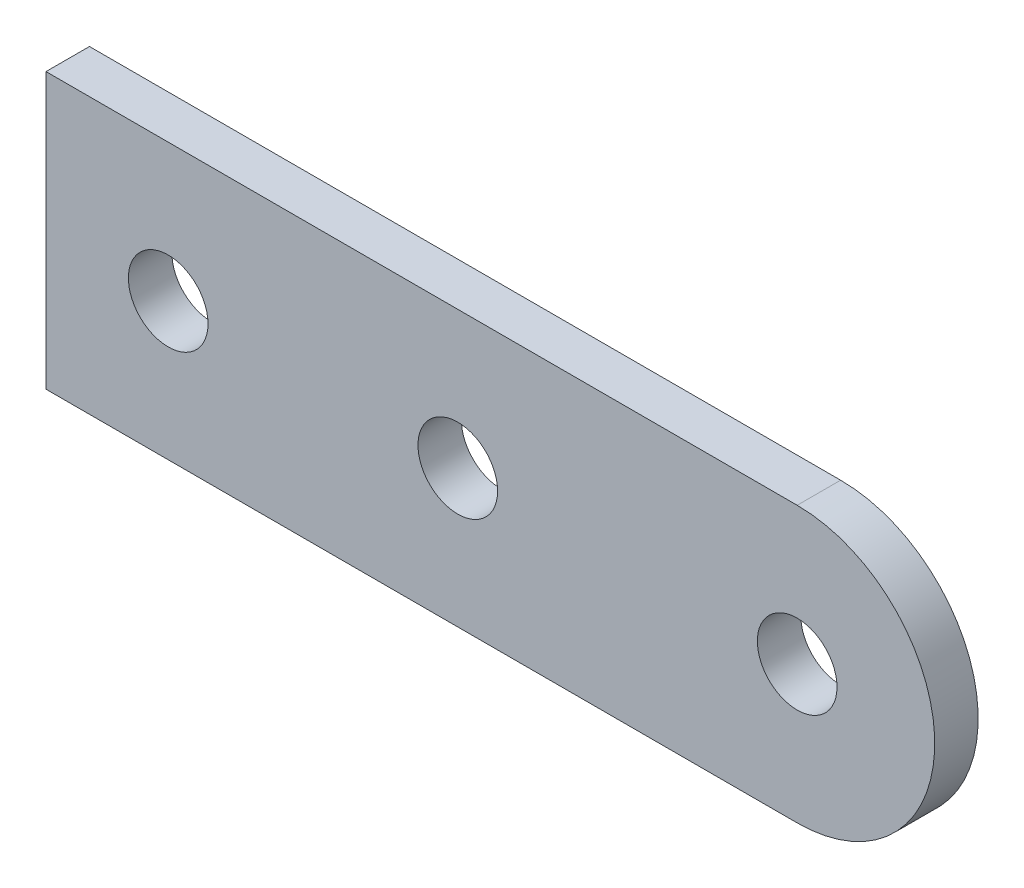
ISO-10303-21;
HEADER;
FILE_DESCRIPTION(('STEP AP214'),'2;1');
FILE_NAME('part.step','',(''),(''),'','','');
FILE_SCHEMA(('AUTOMOTIVE_DESIGN { 1 0 10303 214 1 1 1 1 }'));
ENDSEC;
DATA;
#1=APPLICATION_CONTEXT('core data for automotive mechanical design processes');
#2=APPLICATION_PROTOCOL_DEFINITION('international standard','automotive_design',2000,#1);
#3=PRODUCT_CONTEXT('',#1,'mechanical');
#4=PRODUCT('Part','Part','',(#3));
#5=PRODUCT_RELATED_PRODUCT_CATEGORY('part','',(#4));
#6=PRODUCT_DEFINITION_FORMATION('','',#4);
#7=PRODUCT_DEFINITION_CONTEXT('part definition',#1,'design');
#8=PRODUCT_DEFINITION('design','',#6,#7);
#9=PRODUCT_DEFINITION_SHAPE('','',#8);
#10=(LENGTH_UNIT() NAMED_UNIT(*) SI_UNIT(.MILLI.,.METRE.));
#11=(NAMED_UNIT(*) PLANE_ANGLE_UNIT() SI_UNIT($,.RADIAN.));
#12=(NAMED_UNIT(*) SI_UNIT($,.STERADIAN.) SOLID_ANGLE_UNIT());
#13=UNCERTAINTY_MEASURE_WITH_UNIT(LENGTH_MEASURE(1.E-05),#10,'distance_accuracy_value','');
#14=(GEOMETRIC_REPRESENTATION_CONTEXT(3) GLOBAL_UNCERTAINTY_ASSIGNED_CONTEXT((#13)) GLOBAL_UNIT_ASSIGNED_CONTEXT((#10,
#11,#12)) REPRESENTATION_CONTEXT('',''));
#15=CARTESIAN_POINT('',(0.,0.,0.));
#16=DIRECTION('',(0.,0.,1.));
#17=DIRECTION('',(1.,0.,0.));
#18=AXIS2_PLACEMENT_3D('',#15,#16,#17);
#19=CARTESIAN_POINT('',(-51.8799999999999,9.49999999999999,3.));
#20=DIRECTION('',(1.,0.,0.));
#21=DIRECTION('',(0.,0.,-1.));
#22=AXIS2_PLACEMENT_3D('',#19,#20,#21);
#23=PLANE('',#22);
#24=DIRECTION('',(0.,-1.,0.));
#25=VECTOR('',#24,1.);
#26=CARTESIAN_POINT('',(-51.8799999999999,9.49999999999999,0.));
#27=LINE('',#26,#25);
#28=CARTESIAN_POINT('',(-51.8799999999999,9.49999999999999,0.));
#29=VERTEX_POINT('',#28);
#30=CARTESIAN_POINT('',(-51.8799999999999,-9.49999999999999,0.));
#31=VERTEX_POINT('',#30);
#32=EDGE_CURVE('E96',#29,#31,#27,.T.);
#33=ORIENTED_EDGE('',*,*,#32,.T.);
#34=DIRECTION('',(0.,0.,-1.));
#35=VECTOR('',#34,1.);
#36=CARTESIAN_POINT('',(-51.8799999999999,-9.49999999999999,3.));
#37=LINE('',#36,#35);
#38=CARTESIAN_POINT('',(-51.8799999999999,-9.49999999999999,3.));
#39=VERTEX_POINT('',#38);
#40=EDGE_CURVE('E11',#39,#31,#37,.T.);
#41=ORIENTED_EDGE('',*,*,#40,.F.);
#42=DIRECTION('',(0.,-1.,0.));
#43=VECTOR('',#42,1.);
#44=CARTESIAN_POINT('',(-51.8799999999999,9.49999999999999,3.));
#45=LINE('',#44,#43);
#46=CARTESIAN_POINT('',(-51.8799999999999,9.49999999999999,3.));
#47=VERTEX_POINT('',#46);
#48=EDGE_CURVE('E84',#47,#39,#45,.T.);
#49=ORIENTED_EDGE('',*,*,#48,.F.);
#50=DIRECTION('',(0.,0.,-1.));
#51=VECTOR('',#50,1.);
#52=CARTESIAN_POINT('',(-51.8799999999999,9.49999999999999,3.));
#53=LINE('',#52,#51);
#54=EDGE_CURVE('E92',#47,#29,#53,.T.);
#55=ORIENTED_EDGE('',*,*,#54,.T.);
#56=EDGE_LOOP('',(#33,#41,#49,#55));
#57=FACE_BOUND('',#56,.T.);
#58=ADVANCED_FACE('F33',(#57),#23,.F.);
#59=CARTESIAN_POINT('',(-51.8799999999999,-9.49999999999999,3.));
#60=DIRECTION('',(0.,1.,0.));
#61=DIRECTION('',(0.,0.,1.));
#62=AXIS2_PLACEMENT_3D('',#59,#60,#61);
#63=PLANE('',#62);
#64=DIRECTION('',(1.,0.,0.));
#65=VECTOR('',#64,1.);
#66=CARTESIAN_POINT('',(-51.8799999999999,-9.49999999999999,0.));
#67=LINE('',#66,#65);
#68=CARTESIAN_POINT('',(0.,-9.49999999999999,0.));
#69=VERTEX_POINT('',#68);
#70=EDGE_CURVE('E88',#31,#69,#67,.T.);
#71=ORIENTED_EDGE('',*,*,#70,.T.);
#72=DIRECTION('',(0.,0.,-1.));
#73=VECTOR('',#72,1.);
#74=CARTESIAN_POINT('',(0.,-9.49999999999999,3.));
#75=LINE('',#74,#73);
#76=CARTESIAN_POINT('',(0.,-9.49999999999999,3.));
#77=VERTEX_POINT('',#76);
#78=EDGE_CURVE('E41',#77,#69,#75,.T.);
#79=ORIENTED_EDGE('',*,*,#78,.F.);
#80=DIRECTION('',(1.,0.,0.));
#81=VECTOR('',#80,1.);
#82=CARTESIAN_POINT('',(-51.8799999999999,-9.49999999999999,3.));
#83=LINE('',#82,#81);
#84=EDGE_CURVE('E79',#39,#77,#83,.T.);
#85=ORIENTED_EDGE('',*,*,#84,.F.);
#86=ORIENTED_EDGE('',*,*,#40,.T.);
#87=EDGE_LOOP('',(#71,#79,#85,#86));
#88=FACE_BOUND('',#87,.T.);
#89=ADVANCED_FACE('F87',(#88),#63,.F.);
#90=CARTESIAN_POINT('',(0.,0.,3.));
#91=DIRECTION('',(0.,0.,-1.));
#92=DIRECTION('',(-1.,0.,0.));
#93=AXIS2_PLACEMENT_3D('',#90,#91,#92);
#94=CYLINDRICAL_SURFACE('',#93,9.49999999999999);
#95=CARTESIAN_POINT('',(0.,0.,0.));
#96=DIRECTION('',(0.,0.,1.));
#97=DIRECTION('',(1.,0.,0.));
#98=AXIS2_PLACEMENT_3D('',#95,#96,#97);
#99=CIRCLE('',#98,9.49999999999999);
#100=CARTESIAN_POINT('',(0.,9.49999999999999,0.));
#101=VERTEX_POINT('',#100);
#102=EDGE_CURVE('E66',#69,#101,#99,.T.);
#103=ORIENTED_EDGE('',*,*,#102,.T.);
#104=DIRECTION('',(0.,0.,-1.));
#105=VECTOR('',#104,1.);
#106=CARTESIAN_POINT('',(0.,9.49999999999999,3.));
#107=LINE('',#106,#105);
#108=CARTESIAN_POINT('',(0.,9.49999999999999,3.));
#109=VERTEX_POINT('',#108);
#110=EDGE_CURVE('E89',#109,#101,#107,.T.);
#111=ORIENTED_EDGE('',*,*,#110,.F.);
#112=CARTESIAN_POINT('',(0.,0.,3.));
#113=DIRECTION('',(0.,0.,1.));
#114=DIRECTION('',(1.,0.,0.));
#115=AXIS2_PLACEMENT_3D('',#112,#113,#114);
#116=CIRCLE('',#115,9.49999999999999);
#117=EDGE_CURVE('E82',#77,#109,#116,.T.);
#118=ORIENTED_EDGE('',*,*,#117,.F.);
#119=ORIENTED_EDGE('',*,*,#78,.T.);
#120=EDGE_LOOP('',(#103,#111,#118,#119));
#121=FACE_BOUND('',#120,.T.);
#122=ADVANCED_FACE('F90',(#121),#94,.T.);
#123=CARTESIAN_POINT('',(-51.8799999999999,9.49999999999999,3.));
#124=DIRECTION('',(0.,-1.,0.));
#125=DIRECTION('',(0.,0.,-1.));
#126=AXIS2_PLACEMENT_3D('',#123,#124,#125);
#127=PLANE('',#126);
#128=DIRECTION('',(-1.,0.,0.));
#129=VECTOR('',#128,1.);
#130=CARTESIAN_POINT('',(-51.8799999999999,9.49999999999999,0.));
#131=LINE('',#130,#129);
#132=EDGE_CURVE('E72',#101,#29,#131,.T.);
#133=ORIENTED_EDGE('',*,*,#132,.T.);
#134=ORIENTED_EDGE('',*,*,#54,.F.);
#135=DIRECTION('',(-1.,0.,0.));
#136=VECTOR('',#135,1.);
#137=CARTESIAN_POINT('',(-51.8799999999999,9.49999999999999,3.));
#138=LINE('',#137,#136);
#139=EDGE_CURVE('E49',#109,#47,#138,.T.);
#140=ORIENTED_EDGE('',*,*,#139,.F.);
#141=ORIENTED_EDGE('',*,*,#110,.T.);
#142=EDGE_LOOP('',(#133,#134,#140,#141));
#143=FACE_BOUND('',#142,.T.);
#144=ADVANCED_FACE('F104',(#143),#127,.F.);
#145=CARTESIAN_POINT('',(0.,0.,3.));
#146=DIRECTION('',(0.,0.,1.));
#147=DIRECTION('',(1.,0.,0.));
#148=AXIS2_PLACEMENT_3D('',#145,#146,#147);
#149=PLANE('',#148);
#150=CARTESIAN_POINT('',(0.,0.,3.));
#151=DIRECTION('',(0.,0.,1.));
#152=DIRECTION('',(1.,0.,0.));
#153=AXIS2_PLACEMENT_3D('',#150,#151,#152);
#154=CIRCLE('',#153,2.74999999999999);
#155=CARTESIAN_POINT('',(2.74999999999999,0.,3.));
#156=VERTEX_POINT('',#155);
#157=EDGE_CURVE('E124',#156,#156,#154,.T.);
#158=ORIENTED_EDGE('',*,*,#157,.F.);
#159=EDGE_LOOP('',(#158));
#160=FACE_BOUND('',#159,.T.);
#161=CARTESIAN_POINT('',(-23.4399999999999,0.,3.));
#162=DIRECTION('',(0.,0.,1.));
#163=DIRECTION('',(1.,0.,0.));
#164=AXIS2_PLACEMENT_3D('',#161,#162,#163);
#165=CIRCLE('',#164,2.74999999999999);
#166=CARTESIAN_POINT('',(-20.6899999999999,0.,3.));
#167=VERTEX_POINT('',#166);
#168=EDGE_CURVE('E118',#167,#167,#165,.T.);
#169=ORIENTED_EDGE('',*,*,#168,.F.);
#170=EDGE_LOOP('',(#169));
#171=FACE_BOUND('',#170,.T.);
#172=CARTESIAN_POINT('',(-43.4399999999999,0.,3.));
#173=DIRECTION('',(0.,0.,1.));
#174=DIRECTION('',(1.,0.,0.));
#175=AXIS2_PLACEMENT_3D('',#172,#173,#174);
#176=CIRCLE('',#175,2.74999999999999);
#177=CARTESIAN_POINT('',(-40.6899999999999,0.,3.));
#178=VERTEX_POINT('',#177);
#179=EDGE_CURVE('E112',#178,#178,#176,.T.);
#180=ORIENTED_EDGE('',*,*,#179,.F.);
#181=EDGE_LOOP('',(#180));
#182=FACE_BOUND('',#181,.T.);
#183=ORIENTED_EDGE('',*,*,#48,.T.);
#184=ORIENTED_EDGE('',*,*,#84,.T.);
#185=ORIENTED_EDGE('',*,*,#117,.T.);
#186=ORIENTED_EDGE('',*,*,#139,.T.);
#187=EDGE_LOOP('',(#183,#184,#185,#186));
#188=FACE_BOUND('',#187,.T.);
#189=ADVANCED_FACE('F80',(#160,#171,#182,#188),#149,.T.);
#190=CARTESIAN_POINT('',(0.,0.,0.));
#191=DIRECTION('',(0.,0.,1.));
#192=DIRECTION('',(1.,0.,0.));
#193=AXIS2_PLACEMENT_3D('',#190,#191,#192);
#194=PLANE('',#193);
#195=CARTESIAN_POINT('',(0.,0.,0.));
#196=DIRECTION('',(0.,0.,1.));
#197=DIRECTION('',(1.,0.,0.));
#198=AXIS2_PLACEMENT_3D('',#195,#196,#197);
#199=CIRCLE('',#198,2.74999999999999);
#200=CARTESIAN_POINT('',(2.74999999999999,0.,0.));
#201=VERTEX_POINT('',#200);
#202=EDGE_CURVE('E121',#201,#201,#199,.T.);
#203=ORIENTED_EDGE('',*,*,#202,.T.);
#204=EDGE_LOOP('',(#203));
#205=FACE_BOUND('',#204,.T.);
#206=CARTESIAN_POINT('',(-23.4399999999999,0.,0.));
#207=DIRECTION('',(0.,0.,1.));
#208=DIRECTION('',(1.,0.,0.));
#209=AXIS2_PLACEMENT_3D('',#206,#207,#208);
#210=CIRCLE('',#209,2.74999999999999);
#211=CARTESIAN_POINT('',(-20.6899999999999,0.,0.));
#212=VERTEX_POINT('',#211);
#213=EDGE_CURVE('E115',#212,#212,#210,.T.);
#214=ORIENTED_EDGE('',*,*,#213,.T.);
#215=EDGE_LOOP('',(#214));
#216=FACE_BOUND('',#215,.T.);
#217=CARTESIAN_POINT('',(-43.4399999999999,0.,0.));
#218=DIRECTION('',(0.,0.,1.));
#219=DIRECTION('',(1.,0.,0.));
#220=AXIS2_PLACEMENT_3D('',#217,#218,#219);
#221=CIRCLE('',#220,2.75);
#222=CARTESIAN_POINT('',(-40.6899999999999,0.,0.));
#223=VERTEX_POINT('',#222);
#224=EDGE_CURVE('E99',#223,#223,#221,.T.);
#225=ORIENTED_EDGE('',*,*,#224,.T.);
#226=EDGE_LOOP('',(#225));
#227=FACE_BOUND('',#226,.T.);
#228=ORIENTED_EDGE('',*,*,#32,.F.);
#229=ORIENTED_EDGE('',*,*,#132,.F.);
#230=ORIENTED_EDGE('',*,*,#102,.F.);
#231=ORIENTED_EDGE('',*,*,#70,.F.);
#232=EDGE_LOOP('',(#228,#229,#230,#231));
#233=FACE_BOUND('',#232,.T.);
#234=ADVANCED_FACE('F107',(#205,#216,#227,#233),#194,.F.);
#235=CARTESIAN_POINT('',(-43.4399999999999,0.,3.));
#236=DIRECTION('',(0.,0.,1.));
#237=DIRECTION('',(1.,0.,0.));
#238=AXIS2_PLACEMENT_3D('',#235,#236,#237);
#239=CYLINDRICAL_SURFACE('',#238,2.75);
#240=ORIENTED_EDGE('',*,*,#224,.F.);
#241=EDGE_LOOP('',(#240));
#242=FACE_BOUND('',#241,.T.);
#243=ORIENTED_EDGE('',*,*,#179,.T.);
#244=EDGE_LOOP('',(#243));
#245=FACE_BOUND('',#244,.T.);
#246=ADVANCED_FACE('F137',(#242,#245),#239,.F.);
#247=CARTESIAN_POINT('',(-23.4399999999999,0.,3.));
#248=DIRECTION('',(0.,0.,1.));
#249=DIRECTION('',(1.,0.,0.));
#250=AXIS2_PLACEMENT_3D('',#247,#248,#249);
#251=CYLINDRICAL_SURFACE('',#250,2.74999999999999);
#252=ORIENTED_EDGE('',*,*,#213,.F.);
#253=EDGE_LOOP('',(#252));
#254=FACE_BOUND('',#253,.T.);
#255=ORIENTED_EDGE('',*,*,#168,.T.);
#256=EDGE_LOOP('',(#255));
#257=FACE_BOUND('',#256,.T.);
#258=ADVANCED_FACE('F139',(#254,#257),#251,.F.);
#259=CARTESIAN_POINT('',(0.,0.,3.));
#260=DIRECTION('',(0.,0.,1.));
#261=DIRECTION('',(1.,0.,0.));
#262=AXIS2_PLACEMENT_3D('',#259,#260,#261);
#263=CYLINDRICAL_SURFACE('',#262,2.74999999999999);
#264=ORIENTED_EDGE('',*,*,#202,.F.);
#265=EDGE_LOOP('',(#264));
#266=FACE_BOUND('',#265,.T.);
#267=ORIENTED_EDGE('',*,*,#157,.T.);
#268=EDGE_LOOP('',(#267));
#269=FACE_BOUND('',#268,.T.);
#270=ADVANCED_FACE('F128',(#266,#269),#263,.F.);
#271=CLOSED_SHELL('',(#58,#89,#122,#144,#189,#234,#246,#258,#270));
#272=MANIFOLD_SOLID_BREP('B2',#271);
#273=ADVANCED_BREP_SHAPE_REPRESENTATION('',(#18,#272),#14);
#274=SHAPE_DEFINITION_REPRESENTATION(#9,#273);
ENDSEC;
END-ISO-10303-21;
